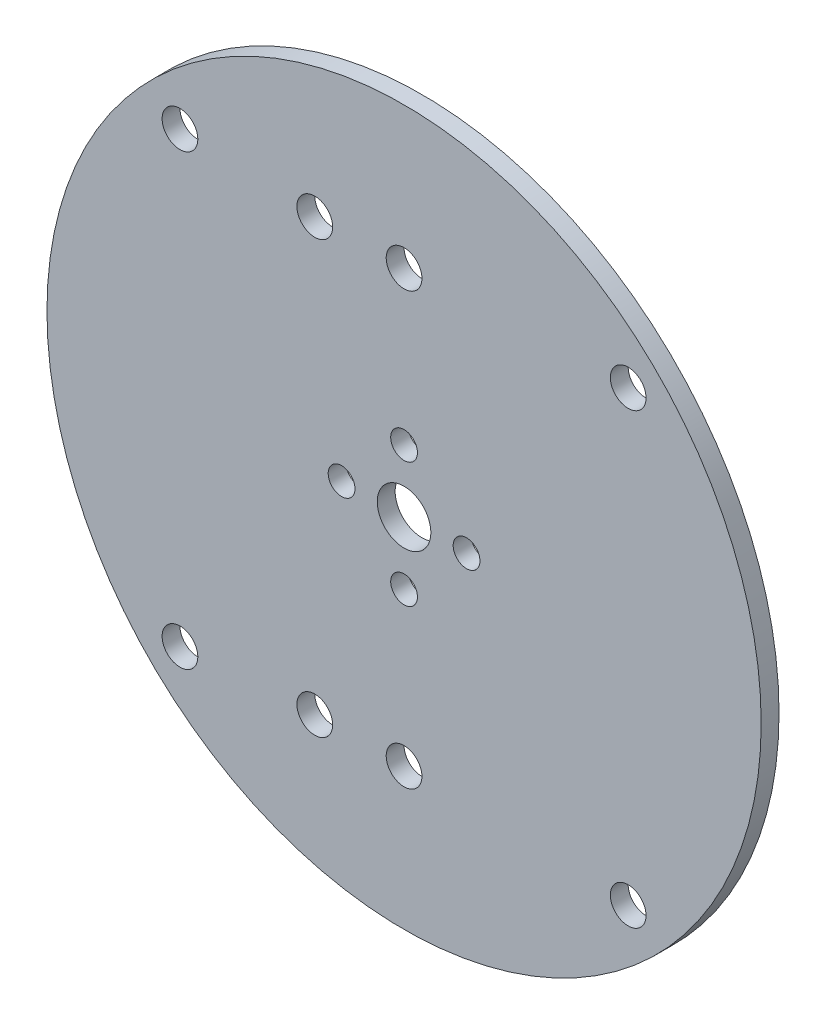
ISO-10303-21;
HEADER;
FILE_DESCRIPTION(('STEP AP214'),'2;1');
FILE_NAME('part.step','',(''),(''),'','','');
FILE_SCHEMA(('AUTOMOTIVE_DESIGN { 1 0 10303 214 1 1 1 1 }'));
ENDSEC;
DATA;
#1=APPLICATION_CONTEXT('core data for automotive mechanical design processes');
#2=APPLICATION_PROTOCOL_DEFINITION('international standard','automotive_design',2000,#1);
#3=PRODUCT_CONTEXT('',#1,'mechanical');
#4=PRODUCT('Part','Part','',(#3));
#5=PRODUCT_RELATED_PRODUCT_CATEGORY('part','',(#4));
#6=PRODUCT_DEFINITION_FORMATION('','',#4);
#7=PRODUCT_DEFINITION_CONTEXT('part definition',#1,'design');
#8=PRODUCT_DEFINITION('design','',#6,#7);
#9=PRODUCT_DEFINITION_SHAPE('','',#8);
#10=(LENGTH_UNIT() NAMED_UNIT(*) SI_UNIT(.MILLI.,.METRE.));
#11=(NAMED_UNIT(*) PLANE_ANGLE_UNIT() SI_UNIT($,.RADIAN.));
#12=(NAMED_UNIT(*) SI_UNIT($,.STERADIAN.) SOLID_ANGLE_UNIT());
#13=UNCERTAINTY_MEASURE_WITH_UNIT(LENGTH_MEASURE(1.E-05),#10,'distance_accuracy_value','');
#14=(GEOMETRIC_REPRESENTATION_CONTEXT(3) GLOBAL_UNCERTAINTY_ASSIGNED_CONTEXT((#13)) GLOBAL_UNIT_ASSIGNED_CONTEXT((#10,
#11,#12)) REPRESENTATION_CONTEXT('',''));
#15=CARTESIAN_POINT('',(0.,0.,0.));
#16=DIRECTION('',(0.,0.,1.));
#17=DIRECTION('',(1.,0.,0.));
#18=AXIS2_PLACEMENT_3D('',#15,#16,#17);
#19=CARTESIAN_POINT('',(64.7426065483763,40.5692941488828,2.));
#20=DIRECTION('',(0.,0.,1.));
#21=DIRECTION('',(1.,0.,0.));
#22=AXIS2_PLACEMENT_3D('',#19,#20,#21);
#23=PLANE('',#22);
#24=CARTESIAN_POINT('',(64.7426065483763,40.5692941488828,2.));
#25=DIRECTION('',(0.,0.,1.));
#26=DIRECTION('',(1.,0.,0.));
#27=AXIS2_PLACEMENT_3D('',#24,#25,#26);
#28=CIRCLE('',#27,3.00000000000001);
#29=CARTESIAN_POINT('',(67.7426065483763,40.5692941488828,2.));
#30=VERTEX_POINT('',#29);
#31=EDGE_CURVE('E108',#30,#30,#28,.T.);
#32=ORIENTED_EDGE('',*,*,#31,.F.);
#33=EDGE_LOOP('',(#32));
#34=FACE_BOUND('',#33,.T.);
#35=CARTESIAN_POINT('',(71.7426065483763,40.5692941488828,2.));
#36=DIRECTION('',(0.,0.,1.));
#37=DIRECTION('',(1.,0.,0.));
#38=AXIS2_PLACEMENT_3D('',#35,#36,#37);
#39=CIRCLE('',#38,1.49999999999994);
#40=CARTESIAN_POINT('',(73.2426065483762,40.5692941488828,2.));
#41=VERTEX_POINT('',#40);
#42=EDGE_CURVE('E96',#41,#41,#39,.T.);
#43=ORIENTED_EDGE('',*,*,#42,.F.);
#44=EDGE_LOOP('',(#43));
#45=FACE_BOUND('',#44,.T.);
#46=CARTESIAN_POINT('',(57.7426065483763,40.5692941488828,2.));
#47=DIRECTION('',(0.,0.,1.));
#48=DIRECTION('',(1.,0.,0.));
#49=AXIS2_PLACEMENT_3D('',#46,#47,#48);
#50=CIRCLE('',#49,1.49999999999995);
#51=CARTESIAN_POINT('',(59.2426065483762,40.5692941488828,2.));
#52=VERTEX_POINT('',#51);
#53=EDGE_CURVE('E84',#52,#52,#50,.T.);
#54=ORIENTED_EDGE('',*,*,#53,.F.);
#55=EDGE_LOOP('',(#54));
#56=FACE_BOUND('',#55,.T.);
#57=CARTESIAN_POINT('',(89.8448972804962,15.4670034167628,2.));
#58=DIRECTION('',(0.,0.,1.));
#59=DIRECTION('',(1.,0.,0.));
#60=AXIS2_PLACEMENT_3D('',#57,#58,#59);
#61=CIRCLE('',#60,2.);
#62=CARTESIAN_POINT('',(91.8448972804962,15.4670034167628,2.));
#63=VERTEX_POINT('',#62);
#64=EDGE_CURVE('E72',#63,#63,#61,.T.);
#65=ORIENTED_EDGE('',*,*,#64,.F.);
#66=EDGE_LOOP('',(#65));
#67=FACE_BOUND('',#66,.T.);
#68=CARTESIAN_POINT('',(54.7426065483771,64.7142941488828,2.));
#69=DIRECTION('',(0.,0.,1.));
#70=DIRECTION('',(1.,0.,0.));
#71=AXIS2_PLACEMENT_3D('',#68,#69,#70);
#72=CIRCLE('',#71,2.);
#73=CARTESIAN_POINT('',(56.7426065483772,64.7142941488828,2.));
#74=VERTEX_POINT('',#73);
#75=EDGE_CURVE('E60',#74,#74,#72,.T.);
#76=ORIENTED_EDGE('',*,*,#75,.F.);
#77=EDGE_LOOP('',(#76));
#78=FACE_BOUND('',#77,.T.);
#79=CARTESIAN_POINT('',(39.6403158162562,15.4670034167628,2.));
#80=DIRECTION('',(0.,0.,1.));
#81=DIRECTION('',(1.,0.,0.));
#82=AXIS2_PLACEMENT_3D('',#79,#80,#81);
#83=CIRCLE('',#82,2.);
#84=CARTESIAN_POINT('',(41.6403158162562,15.4670034167628,2.));
#85=VERTEX_POINT('',#84);
#86=EDGE_CURVE('E48',#85,#85,#83,.T.);
#87=ORIENTED_EDGE('',*,*,#86,.F.);
#88=EDGE_LOOP('',(#87));
#89=FACE_BOUND('',#88,.T.);
#90=CARTESIAN_POINT('',(64.7426065483763,40.5692941488828,2.));
#91=DIRECTION('',(0.,0.,1.));
#92=DIRECTION('',(1.,0.,0.));
#93=AXIS2_PLACEMENT_3D('',#90,#91,#92);
#94=CIRCLE('',#93,40.);
#95=CARTESIAN_POINT('',(104.742606548376,40.5692941488828,2.));
#96=VERTEX_POINT('',#95);
#97=EDGE_CURVE('E10',#96,#96,#94,.T.);
#98=ORIENTED_EDGE('',*,*,#97,.T.);
#99=EDGE_LOOP('',(#98));
#100=FACE_BOUND('',#99,.T.);
#101=CARTESIAN_POINT('',(89.8448972804962,65.6715848810028,2.));
#102=DIRECTION('',(0.,0.,1.));
#103=DIRECTION('',(1.,0.,0.));
#104=AXIS2_PLACEMENT_3D('',#101,#102,#103);
#105=CIRCLE('',#104,2.);
#106=CARTESIAN_POINT('',(91.8448972804962,65.6715848810028,2.));
#107=VERTEX_POINT('',#106);
#108=EDGE_CURVE('E43',#107,#107,#105,.T.);
#109=ORIENTED_EDGE('',*,*,#108,.F.);
#110=EDGE_LOOP('',(#109));
#111=FACE_BOUND('',#110,.T.);
#112=CARTESIAN_POINT('',(39.6403158162562,65.6715848810028,2.));
#113=DIRECTION('',(0.,0.,1.));
#114=DIRECTION('',(1.,0.,0.));
#115=AXIS2_PLACEMENT_3D('',#112,#113,#114);
#116=CIRCLE('',#115,2.);
#117=CARTESIAN_POINT('',(41.6403158162562,65.6715848810028,2.));
#118=VERTEX_POINT('',#117);
#119=EDGE_CURVE('E54',#118,#118,#116,.T.);
#120=ORIENTED_EDGE('',*,*,#119,.F.);
#121=EDGE_LOOP('',(#120));
#122=FACE_BOUND('',#121,.T.);
#123=CARTESIAN_POINT('',(64.7426065483763,64.7142941488828,2.));
#124=DIRECTION('',(0.,0.,1.));
#125=DIRECTION('',(1.,0.,0.));
#126=AXIS2_PLACEMENT_3D('',#123,#124,#125);
#127=CIRCLE('',#126,2.);
#128=CARTESIAN_POINT('',(66.7426065483763,64.7142941488828,2.));
#129=VERTEX_POINT('',#128);
#130=EDGE_CURVE('E66',#129,#129,#127,.T.);
#131=ORIENTED_EDGE('',*,*,#130,.F.);
#132=EDGE_LOOP('',(#131));
#133=FACE_BOUND('',#132,.T.);
#134=CARTESIAN_POINT('',(64.7426065483763,16.4142941488828,2.));
#135=DIRECTION('',(0.,0.,1.));
#136=DIRECTION('',(1.,0.,0.));
#137=AXIS2_PLACEMENT_3D('',#134,#135,#136);
#138=CIRCLE('',#137,2.);
#139=CARTESIAN_POINT('',(66.7426065483763,16.4142941488828,2.));
#140=VERTEX_POINT('',#139);
#141=EDGE_CURVE('E78',#140,#140,#138,.T.);
#142=ORIENTED_EDGE('',*,*,#141,.F.);
#143=EDGE_LOOP('',(#142));
#144=FACE_BOUND('',#143,.T.);
#145=CARTESIAN_POINT('',(64.7426065483763,33.5692941488828,2.));
#146=DIRECTION('',(0.,0.,1.));
#147=DIRECTION('',(1.,0.,0.));
#148=AXIS2_PLACEMENT_3D('',#145,#146,#147);
#149=CIRCLE('',#148,1.49999999999994);
#150=CARTESIAN_POINT('',(66.2426065483762,33.5692941488828,2.));
#151=VERTEX_POINT('',#150);
#152=EDGE_CURVE('E90',#151,#151,#149,.T.);
#153=ORIENTED_EDGE('',*,*,#152,.F.);
#154=EDGE_LOOP('',(#153));
#155=FACE_BOUND('',#154,.T.);
#156=CARTESIAN_POINT('',(64.7426065483763,47.5692941488828,2.));
#157=DIRECTION('',(0.,0.,1.));
#158=DIRECTION('',(1.,0.,0.));
#159=AXIS2_PLACEMENT_3D('',#156,#157,#158);
#160=CIRCLE('',#159,1.49999999999994);
#161=CARTESIAN_POINT('',(66.2426065483762,47.5692941488828,2.));
#162=VERTEX_POINT('',#161);
#163=EDGE_CURVE('E102',#162,#162,#160,.T.);
#164=ORIENTED_EDGE('',*,*,#163,.F.);
#165=EDGE_LOOP('',(#164));
#166=FACE_BOUND('',#165,.T.);
#167=CARTESIAN_POINT('',(54.7426065483771,16.4142941488828,2.));
#168=DIRECTION('',(0.,0.,1.));
#169=DIRECTION('',(1.,0.,0.));
#170=AXIS2_PLACEMENT_3D('',#167,#168,#169);
#171=CIRCLE('',#170,2.);
#172=CARTESIAN_POINT('',(56.7426065483772,16.4142941488828,2.));
#173=VERTEX_POINT('',#172);
#174=EDGE_CURVE('E114',#173,#173,#171,.T.);
#175=ORIENTED_EDGE('',*,*,#174,.F.);
#176=EDGE_LOOP('',(#175));
#177=FACE_BOUND('',#176,.T.);
#178=ADVANCED_FACE('F32',(#34,#45,#56,#67,#78,#89,#100,#111,#122,#133,#144,#155,#166,#177),#23,.T.);
#179=CARTESIAN_POINT('',(64.7426065483763,40.5692941488828,0.));
#180=DIRECTION('',(0.,0.,1.));
#181=DIRECTION('',(1.,0.,0.));
#182=AXIS2_PLACEMENT_3D('',#179,#180,#181);
#183=PLANE('',#182);
#184=CARTESIAN_POINT('',(64.7426065483763,40.5692941488828,0.));
#185=DIRECTION('',(0.,0.,1.));
#186=DIRECTION('',(1.,0.,0.));
#187=AXIS2_PLACEMENT_3D('',#184,#185,#186);
#188=CIRCLE('',#187,40.);
#189=CARTESIAN_POINT('',(104.742606548376,40.5692941488828,0.));
#190=VERTEX_POINT('',#189);
#191=EDGE_CURVE('E36',#190,#190,#188,.T.);
#192=ORIENTED_EDGE('',*,*,#191,.F.);
#193=EDGE_LOOP('',(#192));
#194=FACE_BOUND('',#193,.T.);
#195=CARTESIAN_POINT('',(89.8448972804962,65.6715848810028,0.));
#196=DIRECTION('',(0.,0.,1.));
#197=DIRECTION('',(1.,0.,0.));
#198=AXIS2_PLACEMENT_3D('',#195,#196,#197);
#199=CIRCLE('',#198,2.);
#200=CARTESIAN_POINT('',(91.8448972804962,65.6715848810028,0.));
#201=VERTEX_POINT('',#200);
#202=EDGE_CURVE('E45',#201,#201,#199,.T.);
#203=ORIENTED_EDGE('',*,*,#202,.T.);
#204=EDGE_LOOP('',(#203));
#205=FACE_BOUND('',#204,.T.);
#206=CARTESIAN_POINT('',(39.6403158162562,15.4670034167628,0.));
#207=DIRECTION('',(0.,0.,1.));
#208=DIRECTION('',(1.,0.,0.));
#209=AXIS2_PLACEMENT_3D('',#206,#207,#208);
#210=CIRCLE('',#209,2.);
#211=CARTESIAN_POINT('',(41.6403158162562,15.4670034167628,0.));
#212=VERTEX_POINT('',#211);
#213=EDGE_CURVE('E51',#212,#212,#210,.T.);
#214=ORIENTED_EDGE('',*,*,#213,.T.);
#215=EDGE_LOOP('',(#214));
#216=FACE_BOUND('',#215,.T.);
#217=CARTESIAN_POINT('',(39.6403158162562,65.6715848810028,0.));
#218=DIRECTION('',(0.,0.,1.));
#219=DIRECTION('',(1.,0.,0.));
#220=AXIS2_PLACEMENT_3D('',#217,#218,#219);
#221=CIRCLE('',#220,2.);
#222=CARTESIAN_POINT('',(41.6403158162562,65.6715848810028,0.));
#223=VERTEX_POINT('',#222);
#224=EDGE_CURVE('E57',#223,#223,#221,.T.);
#225=ORIENTED_EDGE('',*,*,#224,.T.);
#226=EDGE_LOOP('',(#225));
#227=FACE_BOUND('',#226,.T.);
#228=CARTESIAN_POINT('',(54.7426065483771,64.7142941488828,0.));
#229=DIRECTION('',(0.,0.,1.));
#230=DIRECTION('',(1.,0.,0.));
#231=AXIS2_PLACEMENT_3D('',#228,#229,#230);
#232=CIRCLE('',#231,2.);
#233=CARTESIAN_POINT('',(56.7426065483772,64.7142941488828,0.));
#234=VERTEX_POINT('',#233);
#235=EDGE_CURVE('E63',#234,#234,#232,.T.);
#236=ORIENTED_EDGE('',*,*,#235,.T.);
#237=EDGE_LOOP('',(#236));
#238=FACE_BOUND('',#237,.T.);
#239=CARTESIAN_POINT('',(64.7426065483763,64.7142941488828,0.));
#240=DIRECTION('',(0.,0.,1.));
#241=DIRECTION('',(1.,0.,0.));
#242=AXIS2_PLACEMENT_3D('',#239,#240,#241);
#243=CIRCLE('',#242,2.);
#244=CARTESIAN_POINT('',(66.7426065483763,64.7142941488828,0.));
#245=VERTEX_POINT('',#244);
#246=EDGE_CURVE('E69',#245,#245,#243,.T.);
#247=ORIENTED_EDGE('',*,*,#246,.T.);
#248=EDGE_LOOP('',(#247));
#249=FACE_BOUND('',#248,.T.);
#250=CARTESIAN_POINT('',(89.8448972804962,15.4670034167628,0.));
#251=DIRECTION('',(0.,0.,1.));
#252=DIRECTION('',(1.,0.,0.));
#253=AXIS2_PLACEMENT_3D('',#250,#251,#252);
#254=CIRCLE('',#253,2.);
#255=CARTESIAN_POINT('',(91.8448972804962,15.4670034167628,0.));
#256=VERTEX_POINT('',#255);
#257=EDGE_CURVE('E75',#256,#256,#254,.T.);
#258=ORIENTED_EDGE('',*,*,#257,.T.);
#259=EDGE_LOOP('',(#258));
#260=FACE_BOUND('',#259,.T.);
#261=CARTESIAN_POINT('',(64.7426065483763,16.4142941488828,0.));
#262=DIRECTION('',(0.,0.,1.));
#263=DIRECTION('',(1.,0.,0.));
#264=AXIS2_PLACEMENT_3D('',#261,#262,#263);
#265=CIRCLE('',#264,2.);
#266=CARTESIAN_POINT('',(66.7426065483763,16.4142941488828,0.));
#267=VERTEX_POINT('',#266);
#268=EDGE_CURVE('E81',#267,#267,#265,.T.);
#269=ORIENTED_EDGE('',*,*,#268,.T.);
#270=EDGE_LOOP('',(#269));
#271=FACE_BOUND('',#270,.T.);
#272=CARTESIAN_POINT('',(57.7426065483763,40.5692941488828,0.));
#273=DIRECTION('',(0.,0.,1.));
#274=DIRECTION('',(1.,0.,0.));
#275=AXIS2_PLACEMENT_3D('',#272,#273,#274);
#276=CIRCLE('',#275,1.49999999999995);
#277=CARTESIAN_POINT('',(59.2426065483762,40.5692941488828,0.));
#278=VERTEX_POINT('',#277);
#279=EDGE_CURVE('E87',#278,#278,#276,.T.);
#280=ORIENTED_EDGE('',*,*,#279,.T.);
#281=EDGE_LOOP('',(#280));
#282=FACE_BOUND('',#281,.T.);
#283=CARTESIAN_POINT('',(64.7426065483763,33.5692941488828,0.));
#284=DIRECTION('',(0.,0.,1.));
#285=DIRECTION('',(1.,0.,0.));
#286=AXIS2_PLACEMENT_3D('',#283,#284,#285);
#287=CIRCLE('',#286,1.49999999999994);
#288=CARTESIAN_POINT('',(66.2426065483762,33.5692941488828,0.));
#289=VERTEX_POINT('',#288);
#290=EDGE_CURVE('E93',#289,#289,#287,.T.);
#291=ORIENTED_EDGE('',*,*,#290,.T.);
#292=EDGE_LOOP('',(#291));
#293=FACE_BOUND('',#292,.T.);
#294=CARTESIAN_POINT('',(71.7426065483763,40.5692941488828,0.));
#295=DIRECTION('',(0.,0.,1.));
#296=DIRECTION('',(1.,0.,0.));
#297=AXIS2_PLACEMENT_3D('',#294,#295,#296);
#298=CIRCLE('',#297,1.49999999999994);
#299=CARTESIAN_POINT('',(73.2426065483762,40.5692941488828,0.));
#300=VERTEX_POINT('',#299);
#301=EDGE_CURVE('E99',#300,#300,#298,.T.);
#302=ORIENTED_EDGE('',*,*,#301,.T.);
#303=EDGE_LOOP('',(#302));
#304=FACE_BOUND('',#303,.T.);
#305=CARTESIAN_POINT('',(64.7426065483763,47.5692941488828,0.));
#306=DIRECTION('',(0.,0.,1.));
#307=DIRECTION('',(1.,0.,0.));
#308=AXIS2_PLACEMENT_3D('',#305,#306,#307);
#309=CIRCLE('',#308,1.49999999999994);
#310=CARTESIAN_POINT('',(66.2426065483762,47.5692941488828,0.));
#311=VERTEX_POINT('',#310);
#312=EDGE_CURVE('E105',#311,#311,#309,.T.);
#313=ORIENTED_EDGE('',*,*,#312,.T.);
#314=EDGE_LOOP('',(#313));
#315=FACE_BOUND('',#314,.T.);
#316=CARTESIAN_POINT('',(64.7426065483763,40.5692941488828,0.));
#317=DIRECTION('',(0.,0.,1.));
#318=DIRECTION('',(1.,0.,0.));
#319=AXIS2_PLACEMENT_3D('',#316,#317,#318);
#320=CIRCLE('',#319,3.00000000000001);
#321=CARTESIAN_POINT('',(67.7426065483763,40.5692941488828,0.));
#322=VERTEX_POINT('',#321);
#323=EDGE_CURVE('E111',#322,#322,#320,.T.);
#324=ORIENTED_EDGE('',*,*,#323,.T.);
#325=EDGE_LOOP('',(#324));
#326=FACE_BOUND('',#325,.T.);
#327=CARTESIAN_POINT('',(54.7426065483771,16.4142941488828,0.));
#328=DIRECTION('',(0.,0.,1.));
#329=DIRECTION('',(1.,0.,0.));
#330=AXIS2_PLACEMENT_3D('',#327,#328,#329);
#331=CIRCLE('',#330,2.);
#332=CARTESIAN_POINT('',(56.7426065483772,16.4142941488828,0.));
#333=VERTEX_POINT('',#332);
#334=EDGE_CURVE('E117',#333,#333,#331,.T.);
#335=ORIENTED_EDGE('',*,*,#334,.T.);
#336=EDGE_LOOP('',(#335));
#337=FACE_BOUND('',#336,.T.);
#338=ADVANCED_FACE('F127',(#194,#205,#216,#227,#238,#249,#260,#271,#282,#293,#304,#315,#326,
#337),#183,.F.);
#339=CARTESIAN_POINT('',(64.7426065483763,40.5692941488828,2.));
#340=DIRECTION('',(0.,0.,-1.));
#341=DIRECTION('',(-1.,0.,0.));
#342=AXIS2_PLACEMENT_3D('',#339,#340,#341);
#343=CYLINDRICAL_SURFACE('',#342,40.);
#344=ORIENTED_EDGE('',*,*,#97,.F.);
#345=EDGE_LOOP('',(#344));
#346=FACE_BOUND('',#345,.T.);
#347=ORIENTED_EDGE('',*,*,#191,.T.);
#348=EDGE_LOOP('',(#347));
#349=FACE_BOUND('',#348,.T.);
#350=ADVANCED_FACE('F34',(#346,#349),#343,.T.);
#351=CARTESIAN_POINT('',(89.8448972804962,65.6715848810028,2.));
#352=DIRECTION('',(0.,0.,-1.));
#353=DIRECTION('',(-1.,0.,0.));
#354=AXIS2_PLACEMENT_3D('',#351,#352,#353);
#355=CYLINDRICAL_SURFACE('',#354,2.);
#356=ORIENTED_EDGE('',*,*,#108,.T.);
#357=EDGE_LOOP('',(#356));
#358=FACE_BOUND('',#357,.T.);
#359=ORIENTED_EDGE('',*,*,#202,.F.);
#360=EDGE_LOOP('',(#359));
#361=FACE_BOUND('',#360,.T.);
#362=ADVANCED_FACE('F137',(#358,#361),#355,.F.);
#363=CARTESIAN_POINT('',(39.6403158162562,15.4670034167628,2.));
#364=DIRECTION('',(0.,0.,-1.));
#365=DIRECTION('',(-1.,0.,0.));
#366=AXIS2_PLACEMENT_3D('',#363,#364,#365);
#367=CYLINDRICAL_SURFACE('',#366,2.);
#368=ORIENTED_EDGE('',*,*,#86,.T.);
#369=EDGE_LOOP('',(#368));
#370=FACE_BOUND('',#369,.T.);
#371=ORIENTED_EDGE('',*,*,#213,.F.);
#372=EDGE_LOOP('',(#371));
#373=FACE_BOUND('',#372,.T.);
#374=ADVANCED_FACE('F140',(#370,#373),#367,.F.);
#375=CARTESIAN_POINT('',(39.6403158162562,65.6715848810028,2.));
#376=DIRECTION('',(0.,0.,-1.));
#377=DIRECTION('',(-1.,0.,0.));
#378=AXIS2_PLACEMENT_3D('',#375,#376,#377);
#379=CYLINDRICAL_SURFACE('',#378,2.);
#380=ORIENTED_EDGE('',*,*,#119,.T.);
#381=EDGE_LOOP('',(#380));
#382=FACE_BOUND('',#381,.T.);
#383=ORIENTED_EDGE('',*,*,#224,.F.);
#384=EDGE_LOOP('',(#383));
#385=FACE_BOUND('',#384,.T.);
#386=ADVANCED_FACE('F144',(#382,#385),#379,.F.);
#387=CARTESIAN_POINT('',(54.7426065483771,64.7142941488828,2.));
#388=DIRECTION('',(0.,0.,-1.));
#389=DIRECTION('',(-1.,0.,0.));
#390=AXIS2_PLACEMENT_3D('',#387,#388,#389);
#391=CYLINDRICAL_SURFACE('',#390,2.);
#392=ORIENTED_EDGE('',*,*,#75,.T.);
#393=EDGE_LOOP('',(#392));
#394=FACE_BOUND('',#393,.T.);
#395=ORIENTED_EDGE('',*,*,#235,.F.);
#396=EDGE_LOOP('',(#395));
#397=FACE_BOUND('',#396,.T.);
#398=ADVANCED_FACE('F148',(#394,#397),#391,.F.);
#399=CARTESIAN_POINT('',(64.7426065483763,64.7142941488828,2.));
#400=DIRECTION('',(0.,0.,-1.));
#401=DIRECTION('',(-1.,0.,0.));
#402=AXIS2_PLACEMENT_3D('',#399,#400,#401);
#403=CYLINDRICAL_SURFACE('',#402,2.);
#404=ORIENTED_EDGE('',*,*,#130,.T.);
#405=EDGE_LOOP('',(#404));
#406=FACE_BOUND('',#405,.T.);
#407=ORIENTED_EDGE('',*,*,#246,.F.);
#408=EDGE_LOOP('',(#407));
#409=FACE_BOUND('',#408,.T.);
#410=ADVANCED_FACE('F152',(#406,#409),#403,.F.);
#411=CARTESIAN_POINT('',(89.8448972804962,15.4670034167628,2.));
#412=DIRECTION('',(0.,0.,-1.));
#413=DIRECTION('',(-1.,0.,0.));
#414=AXIS2_PLACEMENT_3D('',#411,#412,#413);
#415=CYLINDRICAL_SURFACE('',#414,2.);
#416=ORIENTED_EDGE('',*,*,#64,.T.);
#417=EDGE_LOOP('',(#416));
#418=FACE_BOUND('',#417,.T.);
#419=ORIENTED_EDGE('',*,*,#257,.F.);
#420=EDGE_LOOP('',(#419));
#421=FACE_BOUND('',#420,.T.);
#422=ADVANCED_FACE('F156',(#418,#421),#415,.F.);
#423=CARTESIAN_POINT('',(64.7426065483763,16.4142941488828,2.));
#424=DIRECTION('',(0.,0.,-1.));
#425=DIRECTION('',(-1.,0.,0.));
#426=AXIS2_PLACEMENT_3D('',#423,#424,#425);
#427=CYLINDRICAL_SURFACE('',#426,2.);
#428=ORIENTED_EDGE('',*,*,#141,.T.);
#429=EDGE_LOOP('',(#428));
#430=FACE_BOUND('',#429,.T.);
#431=ORIENTED_EDGE('',*,*,#268,.F.);
#432=EDGE_LOOP('',(#431));
#433=FACE_BOUND('',#432,.T.);
#434=ADVANCED_FACE('F160',(#430,#433),#427,.F.);
#435=CARTESIAN_POINT('',(57.7426065483763,40.5692941488828,2.));
#436=DIRECTION('',(0.,0.,-1.));
#437=DIRECTION('',(-1.,0.,0.));
#438=AXIS2_PLACEMENT_3D('',#435,#436,#437);
#439=CYLINDRICAL_SURFACE('',#438,1.49999999999995);
#440=ORIENTED_EDGE('',*,*,#53,.T.);
#441=EDGE_LOOP('',(#440));
#442=FACE_BOUND('',#441,.T.);
#443=ORIENTED_EDGE('',*,*,#279,.F.);
#444=EDGE_LOOP('',(#443));
#445=FACE_BOUND('',#444,.T.);
#446=ADVANCED_FACE('F164',(#442,#445),#439,.F.);
#447=CARTESIAN_POINT('',(64.7426065483763,33.5692941488828,2.));
#448=DIRECTION('',(0.,0.,-1.));
#449=DIRECTION('',(-1.,0.,0.));
#450=AXIS2_PLACEMENT_3D('',#447,#448,#449);
#451=CYLINDRICAL_SURFACE('',#450,1.49999999999994);
#452=ORIENTED_EDGE('',*,*,#152,.T.);
#453=EDGE_LOOP('',(#452));
#454=FACE_BOUND('',#453,.T.);
#455=ORIENTED_EDGE('',*,*,#290,.F.);
#456=EDGE_LOOP('',(#455));
#457=FACE_BOUND('',#456,.T.);
#458=ADVANCED_FACE('F168',(#454,#457),#451,.F.);
#459=CARTESIAN_POINT('',(71.7426065483763,40.5692941488828,2.));
#460=DIRECTION('',(0.,0.,-1.));
#461=DIRECTION('',(-1.,0.,0.));
#462=AXIS2_PLACEMENT_3D('',#459,#460,#461);
#463=CYLINDRICAL_SURFACE('',#462,1.49999999999994);
#464=ORIENTED_EDGE('',*,*,#42,.T.);
#465=EDGE_LOOP('',(#464));
#466=FACE_BOUND('',#465,.T.);
#467=ORIENTED_EDGE('',*,*,#301,.F.);
#468=EDGE_LOOP('',(#467));
#469=FACE_BOUND('',#468,.T.);
#470=ADVANCED_FACE('F172',(#466,#469),#463,.F.);
#471=CARTESIAN_POINT('',(64.7426065483763,47.5692941488828,2.));
#472=DIRECTION('',(0.,0.,-1.));
#473=DIRECTION('',(-1.,0.,0.));
#474=AXIS2_PLACEMENT_3D('',#471,#472,#473);
#475=CYLINDRICAL_SURFACE('',#474,1.49999999999994);
#476=ORIENTED_EDGE('',*,*,#163,.T.);
#477=EDGE_LOOP('',(#476));
#478=FACE_BOUND('',#477,.T.);
#479=ORIENTED_EDGE('',*,*,#312,.F.);
#480=EDGE_LOOP('',(#479));
#481=FACE_BOUND('',#480,.T.);
#482=ADVANCED_FACE('F176',(#478,#481),#475,.F.);
#483=CARTESIAN_POINT('',(64.7426065483763,40.5692941488828,2.));
#484=DIRECTION('',(0.,0.,-1.));
#485=DIRECTION('',(-1.,0.,0.));
#486=AXIS2_PLACEMENT_3D('',#483,#484,#485);
#487=CYLINDRICAL_SURFACE('',#486,3.00000000000001);
#488=ORIENTED_EDGE('',*,*,#31,.T.);
#489=EDGE_LOOP('',(#488));
#490=FACE_BOUND('',#489,.T.);
#491=ORIENTED_EDGE('',*,*,#323,.F.);
#492=EDGE_LOOP('',(#491));
#493=FACE_BOUND('',#492,.T.);
#494=ADVANCED_FACE('F180',(#490,#493),#487,.F.);
#495=CARTESIAN_POINT('',(54.7426065483771,16.4142941488828,2.));
#496=DIRECTION('',(0.,0.,-1.));
#497=DIRECTION('',(-1.,0.,0.));
#498=AXIS2_PLACEMENT_3D('',#495,#496,#497);
#499=CYLINDRICAL_SURFACE('',#498,2.);
#500=ORIENTED_EDGE('',*,*,#174,.T.);
#501=EDGE_LOOP('',(#500));
#502=FACE_BOUND('',#501,.T.);
#503=ORIENTED_EDGE('',*,*,#334,.F.);
#504=EDGE_LOOP('',(#503));
#505=FACE_BOUND('',#504,.T.);
#506=ADVANCED_FACE('F123',(#502,#505),#499,.F.);
#507=CLOSED_SHELL('',(#178,#338,#350,#362,#374,#386,#398,#410,#422,#434,#446,#458,#470,#482,
#494,#506));
#508=MANIFOLD_SOLID_BREP('B2',#507);
#509=ADVANCED_BREP_SHAPE_REPRESENTATION('',(#18,#508),#14);
#510=SHAPE_DEFINITION_REPRESENTATION(#9,#509);
ENDSEC;
END-ISO-10303-21;
